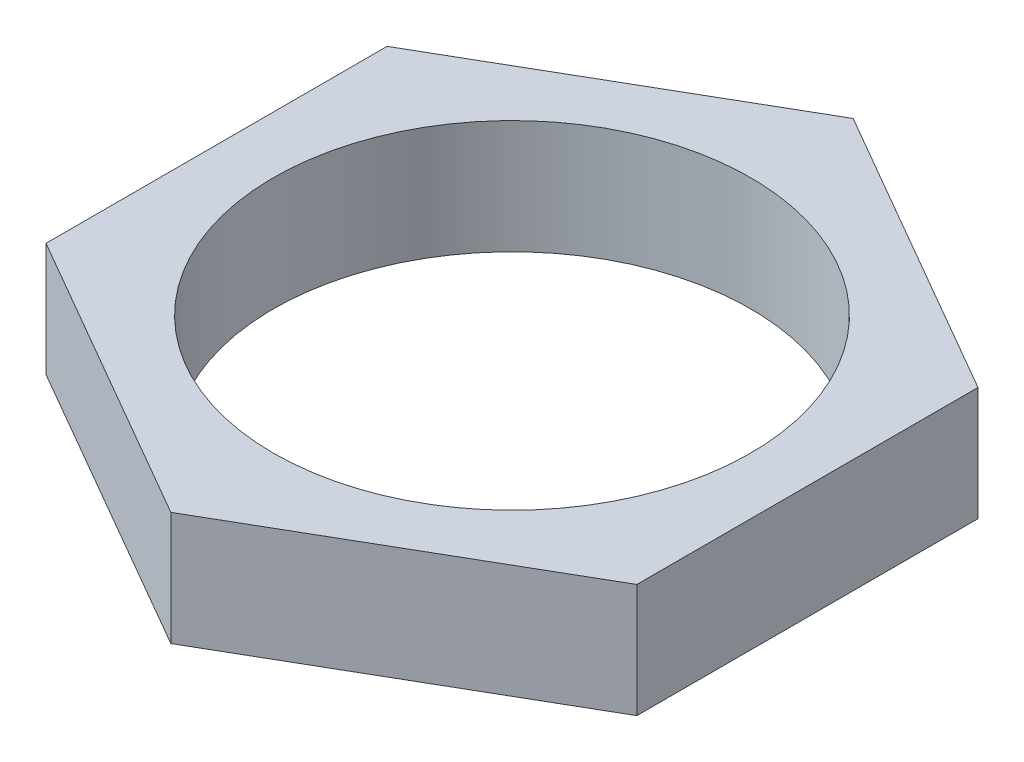
ISO-10303-21;
HEADER;
FILE_DESCRIPTION(('STEP AP214'),'2;1');
FILE_NAME('part.step','',(''),(''),'','','');
FILE_SCHEMA(('AUTOMOTIVE_DESIGN { 1 0 10303 214 1 1 1 1 }'));
ENDSEC;
DATA;
#1=APPLICATION_CONTEXT('core data for automotive mechanical design processes');
#2=APPLICATION_PROTOCOL_DEFINITION('international standard','automotive_design',2000,#1);
#3=PRODUCT_CONTEXT('',#1,'mechanical');
#4=PRODUCT('Part','Part','',(#3));
#5=PRODUCT_RELATED_PRODUCT_CATEGORY('part','',(#4));
#6=PRODUCT_DEFINITION_FORMATION('','',#4);
#7=PRODUCT_DEFINITION_CONTEXT('part definition',#1,'design');
#8=PRODUCT_DEFINITION('design','',#6,#7);
#9=PRODUCT_DEFINITION_SHAPE('','',#8);
#10=(LENGTH_UNIT() NAMED_UNIT(*) SI_UNIT(.MILLI.,.METRE.));
#11=(NAMED_UNIT(*) PLANE_ANGLE_UNIT() SI_UNIT($,.RADIAN.));
#12=(NAMED_UNIT(*) SI_UNIT($,.STERADIAN.) SOLID_ANGLE_UNIT());
#13=UNCERTAINTY_MEASURE_WITH_UNIT(LENGTH_MEASURE(1.E-05),#10,'distance_accuracy_value','');
#14=(GEOMETRIC_REPRESENTATION_CONTEXT(3) GLOBAL_UNCERTAINTY_ASSIGNED_CONTEXT((#13)) GLOBAL_UNIT_ASSIGNED_CONTEXT((#10,
#11,#12)) REPRESENTATION_CONTEXT('',''));
#15=CARTESIAN_POINT('',(0.,0.,0.));
#16=DIRECTION('',(0.,0.,1.));
#17=DIRECTION('',(1.,0.,0.));
#18=AXIS2_PLACEMENT_3D('',#15,#16,#17);
#19=CARTESIAN_POINT('',(0.,5.,0.));
#20=DIRECTION('',(0.,1.,0.));
#21=DIRECTION('',(0.,0.,1.));
#22=AXIS2_PLACEMENT_3D('',#19,#20,#21);
#23=PLANE('',#22);
#24=DIRECTION('',(-0.866025403784439,0.,-0.5));
#25=VECTOR('',#24,1.);
#26=CARTESIAN_POINT('',(13.,5.,-7.50555349946514));
#27=LINE('',#26,#25);
#28=CARTESIAN_POINT('',(13.,5.,-7.50555349946514));
#29=VERTEX_POINT('',#28);
#30=CARTESIAN_POINT('',(0.,5.,-15.0111069989303));
#31=VERTEX_POINT('',#30);
#32=EDGE_CURVE('E131',#29,#31,#27,.T.);
#33=ORIENTED_EDGE('',*,*,#32,.T.);
#34=DIRECTION('',(-0.866025403784439,0.,0.5));
#35=VECTOR('',#34,1.);
#36=CARTESIAN_POINT('',(0.,5.,-15.0111069989303));
#37=LINE('',#36,#35);
#38=CARTESIAN_POINT('',(-13.,5.,-7.50555349946514));
#39=VERTEX_POINT('',#38);
#40=EDGE_CURVE('E89',#31,#39,#37,.T.);
#41=ORIENTED_EDGE('',*,*,#40,.T.);
#42=DIRECTION('',(0.,0.,1.));
#43=VECTOR('',#42,1.);
#44=CARTESIAN_POINT('',(-13.,5.,-7.50555349946514));
#45=LINE('',#44,#43);
#46=CARTESIAN_POINT('',(-13.,5.,7.50555349946513));
#47=VERTEX_POINT('',#46);
#48=EDGE_CURVE('E102',#39,#47,#45,.T.);
#49=ORIENTED_EDGE('',*,*,#48,.T.);
#50=DIRECTION('',(0.866025403784439,0.,0.5));
#51=VECTOR('',#50,1.);
#52=CARTESIAN_POINT('',(-13.,5.,7.50555349946513));
#53=LINE('',#52,#51);
#54=CARTESIAN_POINT('',(0.,5.,15.0111069989303));
#55=VERTEX_POINT('',#54);
#56=EDGE_CURVE('E96',#47,#55,#53,.T.);
#57=ORIENTED_EDGE('',*,*,#56,.T.);
#58=DIRECTION('',(0.866025403784439,0.,-0.5));
#59=VECTOR('',#58,1.);
#60=CARTESIAN_POINT('',(0.,5.,15.0111069989303));
#61=LINE('',#60,#59);
#62=CARTESIAN_POINT('',(13.,5.,7.50555349946514));
#63=VERTEX_POINT('',#62);
#64=EDGE_CURVE('E100',#55,#63,#61,.T.);
#65=ORIENTED_EDGE('',*,*,#64,.T.);
#66=DIRECTION('',(0.,0.,-1.));
#67=VECTOR('',#66,1.);
#68=CARTESIAN_POINT('',(13.,5.,7.50555349946514));
#69=LINE('',#68,#67);
#70=EDGE_CURVE('E52',#63,#29,#69,.T.);
#71=ORIENTED_EDGE('',*,*,#70,.T.);
#72=EDGE_LOOP('',(#33,#41,#49,#57,#65,#71));
#73=FACE_BOUND('',#72,.T.);
#74=CARTESIAN_POINT('',(0.,5.,0.));
#75=DIRECTION('',(0.,1.,0.));
#76=DIRECTION('',(0.,0.,1.));
#77=AXIS2_PLACEMENT_3D('',#74,#75,#76);
#78=CIRCLE('',#77,10.5);
#79=CARTESIAN_POINT('',(0.,5.,10.5));
#80=VERTEX_POINT('',#79);
#81=EDGE_CURVE('E124',#80,#80,#78,.T.);
#82=ORIENTED_EDGE('',*,*,#81,.F.);
#83=EDGE_LOOP('',(#82));
#84=FACE_BOUND('',#83,.T.);
#85=ADVANCED_FACE('F35',(#73,#84),#23,.T.);
#86=CARTESIAN_POINT('',(0.,0.,0.));
#87=DIRECTION('',(0.,1.,0.));
#88=DIRECTION('',(0.,0.,1.));
#89=AXIS2_PLACEMENT_3D('',#86,#87,#88);
#90=PLANE('',#89);
#91=DIRECTION('',(-0.866025403784439,0.,-0.5));
#92=VECTOR('',#91,1.);
#93=CARTESIAN_POINT('',(13.,0.,-7.50555349946514));
#94=LINE('',#93,#92);
#95=CARTESIAN_POINT('',(13.,0.,-7.50555349946514));
#96=VERTEX_POINT('',#95);
#97=CARTESIAN_POINT('',(0.,0.,-15.0111069989303));
#98=VERTEX_POINT('',#97);
#99=EDGE_CURVE('E120',#96,#98,#94,.T.);
#100=ORIENTED_EDGE('',*,*,#99,.F.);
#101=DIRECTION('',(0.,0.,-1.));
#102=VECTOR('',#101,1.);
#103=CARTESIAN_POINT('',(13.,0.,7.50555349946514));
#104=LINE('',#103,#102);
#105=CARTESIAN_POINT('',(13.,0.,7.50555349946514));
#106=VERTEX_POINT('',#105);
#107=EDGE_CURVE('E81',#106,#96,#104,.T.);
#108=ORIENTED_EDGE('',*,*,#107,.F.);
#109=DIRECTION('',(0.866025403784439,0.,-0.5));
#110=VECTOR('',#109,1.);
#111=CARTESIAN_POINT('',(0.,0.,15.0111069989303));
#112=LINE('',#111,#110);
#113=CARTESIAN_POINT('',(0.,0.,15.0111069989303));
#114=VERTEX_POINT('',#113);
#115=EDGE_CURVE('E75',#114,#106,#112,.T.);
#116=ORIENTED_EDGE('',*,*,#115,.F.);
#117=DIRECTION('',(0.866025403784439,0.,0.5));
#118=VECTOR('',#117,1.);
#119=CARTESIAN_POINT('',(-13.,0.,7.50555349946513));
#120=LINE('',#119,#118);
#121=CARTESIAN_POINT('',(-13.,0.,7.50555349946513));
#122=VERTEX_POINT('',#121);
#123=EDGE_CURVE('E110',#122,#114,#120,.T.);
#124=ORIENTED_EDGE('',*,*,#123,.F.);
#125=DIRECTION('',(0.,0.,1.));
#126=VECTOR('',#125,1.);
#127=CARTESIAN_POINT('',(-13.,0.,-7.50555349946514));
#128=LINE('',#127,#126);
#129=CARTESIAN_POINT('',(-13.,0.,-7.50555349946514));
#130=VERTEX_POINT('',#129);
#131=EDGE_CURVE('E126',#130,#122,#128,.T.);
#132=ORIENTED_EDGE('',*,*,#131,.F.);
#133=DIRECTION('',(-0.866025403784439,0.,0.5));
#134=VECTOR('',#133,1.);
#135=CARTESIAN_POINT('',(0.,0.,-15.0111069989303));
#136=LINE('',#135,#134);
#137=EDGE_CURVE('E123',#98,#130,#136,.T.);
#138=ORIENTED_EDGE('',*,*,#137,.F.);
#139=EDGE_LOOP('',(#100,#108,#116,#124,#132,#138));
#140=FACE_BOUND('',#139,.T.);
#141=CARTESIAN_POINT('',(0.,0.,0.));
#142=DIRECTION('',(0.,1.,0.));
#143=DIRECTION('',(0.,0.,1.));
#144=AXIS2_PLACEMENT_3D('',#141,#142,#143);
#145=CIRCLE('',#144,10.5);
#146=CARTESIAN_POINT('',(0.,0.,10.5));
#147=VERTEX_POINT('',#146);
#148=EDGE_CURVE('E224',#147,#147,#145,.T.);
#149=ORIENTED_EDGE('',*,*,#148,.T.);
#150=EDGE_LOOP('',(#149));
#151=FACE_BOUND('',#150,.T.);
#152=ADVANCED_FACE('F140',(#140,#151),#90,.F.);
#153=CARTESIAN_POINT('',(13.,5.,-7.50555349946514));
#154=DIRECTION('',(-0.5,0.,0.866025403784439));
#155=DIRECTION('',(0.866025403784439,0.,0.5));
#156=AXIS2_PLACEMENT_3D('',#153,#154,#155);
#157=PLANE('',#156);
#158=ORIENTED_EDGE('',*,*,#99,.T.);
#159=DIRECTION('',(0.,-1.,0.));
#160=VECTOR('',#159,1.);
#161=CARTESIAN_POINT('',(0.,5.,-15.0111069989303));
#162=LINE('',#161,#160);
#163=EDGE_CURVE('E11',#31,#98,#162,.T.);
#164=ORIENTED_EDGE('',*,*,#163,.F.);
#165=ORIENTED_EDGE('',*,*,#32,.F.);
#166=DIRECTION('',(0.,-1.,0.));
#167=VECTOR('',#166,1.);
#168=CARTESIAN_POINT('',(13.,5.,-7.50555349946514));
#169=LINE('',#168,#167);
#170=EDGE_CURVE('E116',#29,#96,#169,.T.);
#171=ORIENTED_EDGE('',*,*,#170,.T.);
#172=EDGE_LOOP('',(#158,#164,#165,#171));
#173=FACE_BOUND('',#172,.T.);
#174=ADVANCED_FACE('F37',(#173),#157,.F.);
#175=CARTESIAN_POINT('',(0.,5.,-15.0111069989303));
#176=DIRECTION('',(0.5,0.,0.866025403784439));
#177=DIRECTION('',(0.866025403784439,0.,-0.5));
#178=AXIS2_PLACEMENT_3D('',#175,#176,#177);
#179=PLANE('',#178);
#180=ORIENTED_EDGE('',*,*,#137,.T.);
#181=DIRECTION('',(0.,-1.,0.));
#182=VECTOR('',#181,1.);
#183=CARTESIAN_POINT('',(-13.,5.,-7.50555349946514));
#184=LINE('',#183,#182);
#185=EDGE_CURVE('E44',#39,#130,#184,.T.);
#186=ORIENTED_EDGE('',*,*,#185,.F.);
#187=ORIENTED_EDGE('',*,*,#40,.F.);
#188=ORIENTED_EDGE('',*,*,#163,.T.);
#189=EDGE_LOOP('',(#180,#186,#187,#188));
#190=FACE_BOUND('',#189,.T.);
#191=ADVANCED_FACE('F165',(#190),#179,.F.);
#192=CARTESIAN_POINT('',(-13.,5.,-7.50555349946514));
#193=DIRECTION('',(1.,0.,0.));
#194=DIRECTION('',(0.,0.,-1.));
#195=AXIS2_PLACEMENT_3D('',#192,#193,#194);
#196=PLANE('',#195);
#197=ORIENTED_EDGE('',*,*,#131,.T.);
#198=DIRECTION('',(0.,-1.,0.));
#199=VECTOR('',#198,1.);
#200=CARTESIAN_POINT('',(-13.,5.,7.50555349946513));
#201=LINE('',#200,#199);
#202=EDGE_CURVE('E111',#47,#122,#201,.T.);
#203=ORIENTED_EDGE('',*,*,#202,.F.);
#204=ORIENTED_EDGE('',*,*,#48,.F.);
#205=ORIENTED_EDGE('',*,*,#185,.T.);
#206=EDGE_LOOP('',(#197,#203,#204,#205));
#207=FACE_BOUND('',#206,.T.);
#208=ADVANCED_FACE('F137',(#207),#196,.F.);
#209=CARTESIAN_POINT('',(-13.,5.,7.50555349946513));
#210=DIRECTION('',(0.5,0.,-0.866025403784438));
#211=DIRECTION('',(-0.866025403784439,0.,-0.5));
#212=AXIS2_PLACEMENT_3D('',#209,#210,#211);
#213=PLANE('',#212);
#214=ORIENTED_EDGE('',*,*,#123,.T.);
#215=DIRECTION('',(0.,-1.,0.));
#216=VECTOR('',#215,1.);
#217=CARTESIAN_POINT('',(0.,5.,15.0111069989303));
#218=LINE('',#217,#216);
#219=EDGE_CURVE('E107',#55,#114,#218,.T.);
#220=ORIENTED_EDGE('',*,*,#219,.F.);
#221=ORIENTED_EDGE('',*,*,#56,.F.);
#222=ORIENTED_EDGE('',*,*,#202,.T.);
#223=EDGE_LOOP('',(#214,#220,#221,#222));
#224=FACE_BOUND('',#223,.T.);
#225=ADVANCED_FACE('F108',(#224),#213,.F.);
#226=CARTESIAN_POINT('',(0.,5.,15.0111069989303));
#227=DIRECTION('',(-0.5,0.,-0.866025403784439));
#228=DIRECTION('',(-0.866025403784439,0.,0.5));
#229=AXIS2_PLACEMENT_3D('',#226,#227,#228);
#230=PLANE('',#229);
#231=ORIENTED_EDGE('',*,*,#115,.T.);
#232=DIRECTION('',(0.,-1.,0.));
#233=VECTOR('',#232,1.);
#234=CARTESIAN_POINT('',(13.,5.,7.50555349946514));
#235=LINE('',#234,#233);
#236=EDGE_CURVE('E112',#63,#106,#235,.T.);
#237=ORIENTED_EDGE('',*,*,#236,.F.);
#238=ORIENTED_EDGE('',*,*,#64,.F.);
#239=ORIENTED_EDGE('',*,*,#219,.T.);
#240=EDGE_LOOP('',(#231,#237,#238,#239));
#241=FACE_BOUND('',#240,.T.);
#242=ADVANCED_FACE('F114',(#241),#230,.F.);
#243=CARTESIAN_POINT('',(13.,5.,7.50555349946514));
#244=DIRECTION('',(-1.,0.,0.));
#245=DIRECTION('',(0.,0.,1.));
#246=AXIS2_PLACEMENT_3D('',#243,#244,#245);
#247=PLANE('',#246);
#248=ORIENTED_EDGE('',*,*,#107,.T.);
#249=ORIENTED_EDGE('',*,*,#170,.F.);
#250=ORIENTED_EDGE('',*,*,#70,.F.);
#251=ORIENTED_EDGE('',*,*,#236,.T.);
#252=EDGE_LOOP('',(#248,#249,#250,#251));
#253=FACE_BOUND('',#252,.T.);
#254=ADVANCED_FACE('F145',(#253),#247,.F.);
#255=CARTESIAN_POINT('',(0.,5.,0.));
#256=DIRECTION('',(0.,-1.,0.));
#257=DIRECTION('',(0.,0.,-1.));
#258=AXIS2_PLACEMENT_3D('',#255,#256,#257);
#259=CYLINDRICAL_SURFACE('',#258,10.5);
#260=ORIENTED_EDGE('',*,*,#81,.T.);
#261=EDGE_LOOP('',(#260));
#262=FACE_BOUND('',#261,.T.);
#263=ORIENTED_EDGE('',*,*,#148,.F.);
#264=EDGE_LOOP('',(#263));
#265=FACE_BOUND('',#264,.T.);
#266=ADVANCED_FACE('F147',(#262,#265),#259,.F.);
#267=CLOSED_SHELL('',(#85,#152,#174,#191,#208,#225,#242,#254,#266));
#268=MANIFOLD_SOLID_BREP('B2',#267);
#269=ADVANCED_BREP_SHAPE_REPRESENTATION('',(#18,#268),#14);
#270=SHAPE_DEFINITION_REPRESENTATION(#9,#269);
ENDSEC;
END-ISO-10303-21;
